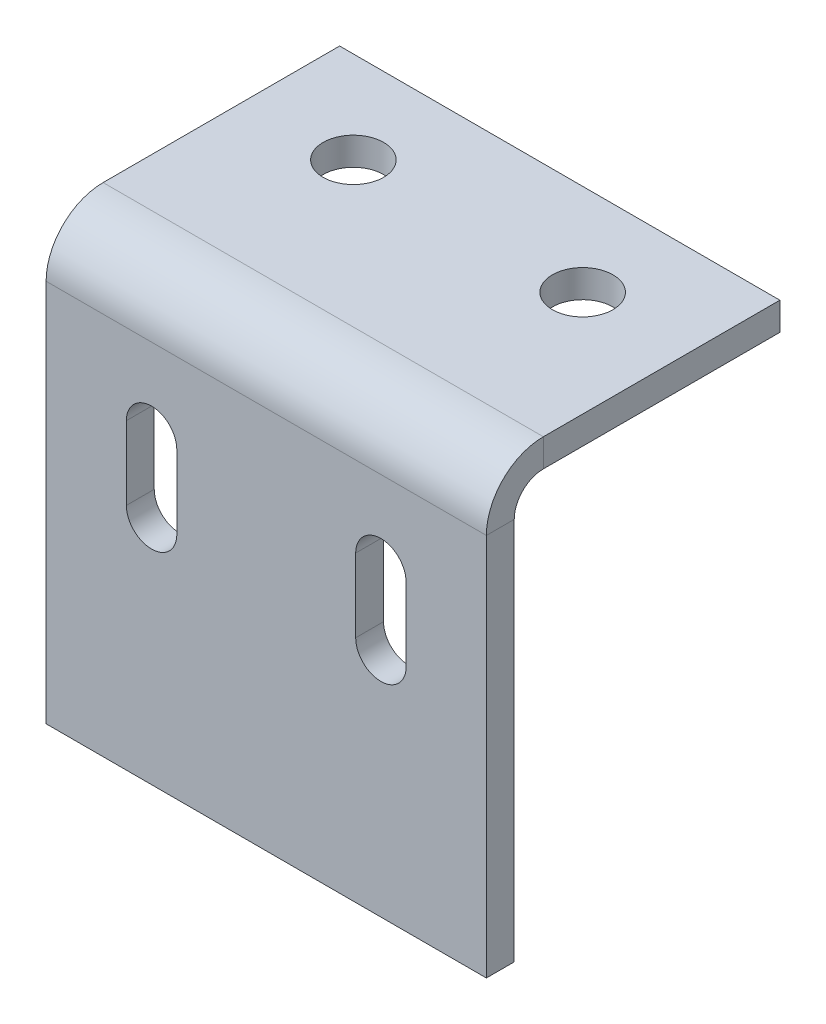
ISO-10303-21;
HEADER;
FILE_DESCRIPTION(('STEP AP214'),'2;1');
FILE_NAME('part.step','',(''),(''),'','','');
FILE_SCHEMA(('AUTOMOTIVE_DESIGN { 1 0 10303 214 1 1 1 1 }'));
ENDSEC;
DATA;
#1=APPLICATION_CONTEXT('core data for automotive mechanical design processes');
#2=APPLICATION_PROTOCOL_DEFINITION('international standard','automotive_design',2000,#1);
#3=PRODUCT_CONTEXT('',#1,'mechanical');
#4=PRODUCT('Part','Part','',(#3));
#5=PRODUCT_RELATED_PRODUCT_CATEGORY('part','',(#4));
#6=PRODUCT_DEFINITION_FORMATION('','',#4);
#7=PRODUCT_DEFINITION_CONTEXT('part definition',#1,'design');
#8=PRODUCT_DEFINITION('design','',#6,#7);
#9=PRODUCT_DEFINITION_SHAPE('','',#8);
#10=(LENGTH_UNIT() NAMED_UNIT(*) SI_UNIT(.MILLI.,.METRE.));
#11=(NAMED_UNIT(*) PLANE_ANGLE_UNIT() SI_UNIT($,.RADIAN.));
#12=(NAMED_UNIT(*) SI_UNIT($,.STERADIAN.) SOLID_ANGLE_UNIT());
#13=UNCERTAINTY_MEASURE_WITH_UNIT(LENGTH_MEASURE(1.E-05),#10,'distance_accuracy_value','');
#14=(GEOMETRIC_REPRESENTATION_CONTEXT(3) GLOBAL_UNCERTAINTY_ASSIGNED_CONTEXT((#13)) GLOBAL_UNIT_ASSIGNED_CONTEXT((#10,
#11,#12)) REPRESENTATION_CONTEXT('',''));
#15=CARTESIAN_POINT('',(0.,0.,0.));
#16=DIRECTION('',(0.,0.,1.));
#17=DIRECTION('',(1.,0.,0.));
#18=AXIS2_PLACEMENT_3D('',#15,#16,#17);
#19=CARTESIAN_POINT('',(-24.,-3.03784,-32.));
#20=DIRECTION('',(-1.,0.,0.));
#21=DIRECTION('',(0.,0.,1.));
#22=AXIS2_PLACEMENT_3D('',#19,#20,#21);
#23=PLANE('',#22);
#24=DIRECTION('',(0.,0.,1.));
#25=VECTOR('',#24,1.);
#26=CARTESIAN_POINT('',(-24.,-3.03784,-32.));
#27=LINE('',#26,#25);
#28=CARTESIAN_POINT('',(-24.,-3.03784,-32.));
#29=VERTEX_POINT('',#28);
#30=CARTESIAN_POINT('',(-24.,-3.03783999999999,-6.21283999999999));
#31=VERTEX_POINT('',#30);
#32=EDGE_CURVE('E286',#29,#31,#27,.T.);
#33=ORIENTED_EDGE('',*,*,#32,.T.);
#34=DIRECTION('',(0.,1.,0.));
#35=VECTOR('',#34,1.);
#36=CARTESIAN_POINT('',(-24.,-3.03783999999999,-6.21283999999999));
#37=LINE('',#36,#35);
#38=CARTESIAN_POINT('',(-24.,0.,-6.21283999999999));
#39=VERTEX_POINT('',#38);
#40=EDGE_CURVE('E270',#31,#39,#37,.T.);
#41=ORIENTED_EDGE('',*,*,#40,.T.);
#42=DIRECTION('',(0.,0.,1.));
#43=VECTOR('',#42,1.);
#44=CARTESIAN_POINT('',(-24.,0.,-32.));
#45=LINE('',#44,#43);
#46=CARTESIAN_POINT('',(-24.,0.,-32.));
#47=VERTEX_POINT('',#46);
#48=EDGE_CURVE('E283',#47,#39,#45,.T.);
#49=ORIENTED_EDGE('',*,*,#48,.F.);
#50=DIRECTION('',(0.,1.,0.));
#51=VECTOR('',#50,1.);
#52=CARTESIAN_POINT('',(-24.,-3.03784,-32.));
#53=LINE('',#52,#51);
#54=EDGE_CURVE('E302',#29,#47,#53,.T.);
#55=ORIENTED_EDGE('',*,*,#54,.F.);
#56=EDGE_LOOP('',(#33,#41,#49,#55));
#57=FACE_BOUND('',#56,.T.);
#58=ADVANCED_FACE('F58',(#57),#23,.T.);
#59=CARTESIAN_POINT('',(0.,-3.03784,0.));
#60=DIRECTION('',(0.,1.,0.));
#61=DIRECTION('',(0.,0.,1.));
#62=AXIS2_PLACEMENT_3D('',#59,#60,#61);
#63=PLANE('',#62);
#64=CARTESIAN_POINT('',(-12.5,-3.03784,-21.9999999999998));
#65=DIRECTION('',(0.,-1.,0.));
#66=DIRECTION('',(0.,0.,-1.));
#67=AXIS2_PLACEMENT_3D('',#64,#65,#66);
#68=CIRCLE('',#67,3.3);
#69=CARTESIAN_POINT('',(-12.5,-3.03784,-25.2999999999998));
#70=VERTEX_POINT('',#69);
#71=EDGE_CURVE('E212',#70,#70,#68,.T.);
#72=ORIENTED_EDGE('',*,*,#71,.F.);
#73=EDGE_LOOP('',(#72));
#74=FACE_BOUND('',#73,.T.);
#75=CARTESIAN_POINT('',(12.5,-3.03784,-21.9999999999998));
#76=DIRECTION('',(0.,-1.,0.));
#77=DIRECTION('',(0.,0.,-1.));
#78=AXIS2_PLACEMENT_3D('',#75,#76,#77);
#79=CIRCLE('',#78,3.3);
#80=CARTESIAN_POINT('',(12.5,-3.03784,-25.2999999999998));
#81=VERTEX_POINT('',#80);
#82=EDGE_CURVE('E224',#81,#81,#79,.T.);
#83=ORIENTED_EDGE('',*,*,#82,.F.);
#84=EDGE_LOOP('',(#83));
#85=FACE_BOUND('',#84,.T.);
#86=DIRECTION('',(-1.,0.,0.));
#87=VECTOR('',#86,1.);
#88=CARTESIAN_POINT('',(-24.,-3.03783999999999,-6.21283999999999));
#89=LINE('',#88,#87);
#90=CARTESIAN_POINT('',(24.,-3.03783999999999,-6.21283999999999));
#91=VERTEX_POINT('',#90);
#92=EDGE_CURVE('E276',#31,#91,#89,.F.);
#93=ORIENTED_EDGE('',*,*,#92,.F.);
#94=ORIENTED_EDGE('',*,*,#32,.F.);
#95=DIRECTION('',(-1.,0.,0.));
#96=VECTOR('',#95,1.);
#97=CARTESIAN_POINT('',(-24.,-3.03784,-32.));
#98=LINE('',#97,#96);
#99=CARTESIAN_POINT('',(24.,-3.03784,-32.));
#100=VERTEX_POINT('',#99);
#101=EDGE_CURVE('E292',#100,#29,#98,.T.);
#102=ORIENTED_EDGE('',*,*,#101,.F.);
#103=DIRECTION('',(0.,0.,-1.));
#104=VECTOR('',#103,1.);
#105=CARTESIAN_POINT('',(24.,-3.03784,-32.));
#106=LINE('',#105,#104);
#107=EDGE_CURVE('E289',#91,#100,#106,.T.);
#108=ORIENTED_EDGE('',*,*,#107,.F.);
#109=EDGE_LOOP('',(#93,#94,#102,#108));
#110=FACE_BOUND('',#109,.T.);
#111=ADVANCED_FACE('F342',(#74,#85,#110),#63,.F.);
#112=CARTESIAN_POINT('',(0.,0.,0.));
#113=DIRECTION('',(0.,1.,0.));
#114=DIRECTION('',(0.,0.,1.));
#115=AXIS2_PLACEMENT_3D('',#112,#113,#114);
#116=PLANE('',#115);
#117=CARTESIAN_POINT('',(-12.5,0.,-21.9999999999998));
#118=DIRECTION('',(0.,-1.,0.));
#119=DIRECTION('',(0.,0.,-1.));
#120=AXIS2_PLACEMENT_3D('',#117,#118,#119);
#121=CIRCLE('',#120,3.29999999999999);
#122=CARTESIAN_POINT('',(-12.5,0.,-25.2999999999998));
#123=VERTEX_POINT('',#122);
#124=EDGE_CURVE('E221',#123,#123,#121,.T.);
#125=ORIENTED_EDGE('',*,*,#124,.T.);
#126=EDGE_LOOP('',(#125));
#127=FACE_BOUND('',#126,.T.);
#128=CARTESIAN_POINT('',(12.5,0.,-21.9999999999998));
#129=DIRECTION('',(0.,-1.,0.));
#130=DIRECTION('',(0.,0.,-1.));
#131=AXIS2_PLACEMENT_3D('',#128,#129,#130);
#132=CIRCLE('',#131,3.29999999999999);
#133=CARTESIAN_POINT('',(12.5,0.,-25.2999999999998));
#134=VERTEX_POINT('',#133);
#135=EDGE_CURVE('E227',#134,#134,#132,.T.);
#136=ORIENTED_EDGE('',*,*,#135,.T.);
#137=EDGE_LOOP('',(#136));
#138=FACE_BOUND('',#137,.T.);
#139=ORIENTED_EDGE('',*,*,#48,.T.);
#140=DIRECTION('',(-1.,0.,0.));
#141=VECTOR('',#140,1.);
#142=CARTESIAN_POINT('',(-24.,0.,-6.21283999999999));
#143=LINE('',#142,#141);
#144=CARTESIAN_POINT('',(24.,0.,-6.21283999999999));
#145=VERTEX_POINT('',#144);
#146=EDGE_CURVE('E263',#39,#145,#143,.F.);
#147=ORIENTED_EDGE('',*,*,#146,.T.);
#148=DIRECTION('',(0.,0.,-1.));
#149=VECTOR('',#148,1.);
#150=CARTESIAN_POINT('',(24.,0.,-32.));
#151=LINE('',#150,#149);
#152=CARTESIAN_POINT('',(24.,0.,-32.));
#153=VERTEX_POINT('',#152);
#154=EDGE_CURVE('E298',#145,#153,#151,.T.);
#155=ORIENTED_EDGE('',*,*,#154,.T.);
#156=DIRECTION('',(-1.,0.,0.));
#157=VECTOR('',#156,1.);
#158=CARTESIAN_POINT('',(-24.,0.,-32.));
#159=LINE('',#158,#157);
#160=EDGE_CURVE('E290',#153,#47,#159,.T.);
#161=ORIENTED_EDGE('',*,*,#160,.T.);
#162=EDGE_LOOP('',(#139,#147,#155,#161));
#163=FACE_BOUND('',#162,.T.);
#164=ADVANCED_FACE('F347',(#127,#138,#163),#116,.T.);
#165=CARTESIAN_POINT('',(-24.,-3.03784,-32.));
#166=DIRECTION('',(0.,0.,-1.));
#167=DIRECTION('',(-1.,0.,0.));
#168=AXIS2_PLACEMENT_3D('',#165,#166,#167);
#169=PLANE('',#168);
#170=ORIENTED_EDGE('',*,*,#160,.F.);
#171=DIRECTION('',(0.,1.,0.));
#172=VECTOR('',#171,1.);
#173=CARTESIAN_POINT('',(24.,-3.03784,-32.));
#174=LINE('',#173,#172);
#175=EDGE_CURVE('E295',#100,#153,#174,.T.);
#176=ORIENTED_EDGE('',*,*,#175,.F.);
#177=ORIENTED_EDGE('',*,*,#101,.T.);
#178=ORIENTED_EDGE('',*,*,#54,.T.);
#179=EDGE_LOOP('',(#170,#176,#177,#178));
#180=FACE_BOUND('',#179,.T.);
#181=ADVANCED_FACE('F359',(#180),#169,.T.);
#182=CARTESIAN_POINT('',(24.,-3.03784,-32.));
#183=DIRECTION('',(1.,0.,0.));
#184=DIRECTION('',(0.,0.,-1.));
#185=AXIS2_PLACEMENT_3D('',#182,#183,#184);
#186=PLANE('',#185);
#187=DIRECTION('',(0.,1.,0.));
#188=VECTOR('',#187,1.);
#189=CARTESIAN_POINT('',(24.,-3.03783999999999,-6.21283999999999));
#190=LINE('',#189,#188);
#191=EDGE_CURVE('E280',#91,#145,#190,.T.);
#192=ORIENTED_EDGE('',*,*,#191,.F.);
#193=ORIENTED_EDGE('',*,*,#107,.T.);
#194=ORIENTED_EDGE('',*,*,#175,.T.);
#195=ORIENTED_EDGE('',*,*,#154,.F.);
#196=EDGE_LOOP('',(#192,#193,#194,#195));
#197=FACE_BOUND('',#196,.T.);
#198=ADVANCED_FACE('F363',(#197),#186,.T.);
#199=CARTESIAN_POINT('',(24.,-6.21283999999999,-6.21283999999999));
#200=DIRECTION('',(1.,0.,0.));
#201=DIRECTION('',(0.,0.,-1.));
#202=AXIS2_PLACEMENT_3D('',#199,#200,#201);
#203=PLANE('',#202);
#204=DIRECTION('',(0.,0.,1.));
#205=VECTOR('',#204,1.);
#206=CARTESIAN_POINT('',(24.,-6.21283999999999,1.56992474575901E-13));
#207=LINE('',#206,#205);
#208=CARTESIAN_POINT('',(24.,-6.21283999999998,-3.03783999999999));
#209=VERTEX_POINT('',#208);
#210=CARTESIAN_POINT('',(24.,-6.21283999999997,0.));
#211=VERTEX_POINT('',#210);
#212=EDGE_CURVE('E230',#209,#211,#207,.T.);
#213=ORIENTED_EDGE('',*,*,#212,.F.);
#214=CARTESIAN_POINT('',(24.,-6.21283999999999,-6.21283999999999));
#215=DIRECTION('',(-1.,0.,0.));
#216=DIRECTION('',(0.,0.,1.));
#217=AXIS2_PLACEMENT_3D('',#214,#215,#216);
#218=CIRCLE('',#217,3.175);
#219=EDGE_CURVE('E273',#91,#209,#218,.F.);
#220=ORIENTED_EDGE('',*,*,#219,.F.);
#221=ORIENTED_EDGE('',*,*,#191,.T.);
#222=CARTESIAN_POINT('',(24.,-6.21283999999999,-6.21283999999999));
#223=DIRECTION('',(-1.,0.,0.));
#224=DIRECTION('',(0.,0.,1.));
#225=AXIS2_PLACEMENT_3D('',#222,#223,#224);
#226=CIRCLE('',#225,6.21284);
#227=EDGE_CURVE('E266',#145,#211,#226,.F.);
#228=ORIENTED_EDGE('',*,*,#227,.T.);
#229=EDGE_LOOP('',(#213,#220,#221,#228));
#230=FACE_BOUND('',#229,.T.);
#231=ADVANCED_FACE('F366',(#230),#203,.T.);
#232=CARTESIAN_POINT('',(-24.,-6.21283999999999,-6.21283999999999));
#233=DIRECTION('',(1.,0.,0.));
#234=DIRECTION('',(0.,0.,-1.));
#235=AXIS2_PLACEMENT_3D('',#232,#233,#234);
#236=PLANE('',#235);
#237=CARTESIAN_POINT('',(-24.,-6.21283999999999,-6.21283999999999));
#238=DIRECTION('',(-1.,0.,0.));
#239=DIRECTION('',(0.,0.,1.));
#240=AXIS2_PLACEMENT_3D('',#237,#238,#239);
#241=CIRCLE('',#240,3.175);
#242=CARTESIAN_POINT('',(-24.,-6.21283999999998,-3.03783999999999));
#243=VERTEX_POINT('',#242);
#244=EDGE_CURVE('E233',#243,#31,#241,.T.);
#245=ORIENTED_EDGE('',*,*,#244,.F.);
#246=DIRECTION('',(0.,0.,1.));
#247=VECTOR('',#246,1.);
#248=CARTESIAN_POINT('',(-24.,-6.21283999999999,-3.03783999999999));
#249=LINE('',#248,#247);
#250=CARTESIAN_POINT('',(-24.,-6.21283999999999,0.));
#251=VERTEX_POINT('',#250);
#252=EDGE_CURVE('E256',#243,#251,#249,.T.);
#253=ORIENTED_EDGE('',*,*,#252,.T.);
#254=CARTESIAN_POINT('',(-24.,-6.21283999999999,-6.21283999999999));
#255=DIRECTION('',(-1.,0.,0.));
#256=DIRECTION('',(0.,0.,1.));
#257=AXIS2_PLACEMENT_3D('',#254,#255,#256);
#258=CIRCLE('',#257,6.21284);
#259=EDGE_CURVE('E267',#251,#39,#258,.T.);
#260=ORIENTED_EDGE('',*,*,#259,.T.);
#261=ORIENTED_EDGE('',*,*,#40,.F.);
#262=EDGE_LOOP('',(#245,#253,#260,#261));
#263=FACE_BOUND('',#262,.T.);
#264=ADVANCED_FACE('F372',(#263),#236,.F.);
#265=CARTESIAN_POINT('',(-24.,-6.21283999999999,-6.21283999999999));
#266=DIRECTION('',(-1.,0.,0.));
#267=DIRECTION('',(0.,0.,1.));
#268=AXIS2_PLACEMENT_3D('',#265,#266,#267);
#269=CYLINDRICAL_SURFACE('',#268,6.21284);
#270=ORIENTED_EDGE('',*,*,#146,.F.);
#271=ORIENTED_EDGE('',*,*,#259,.F.);
#272=DIRECTION('',(-1.,0.,0.));
#273=VECTOR('',#272,1.);
#274=CARTESIAN_POINT('',(0.,-6.21283999999999,0.));
#275=LINE('',#274,#273);
#276=EDGE_CURVE('E253',#211,#251,#275,.T.);
#277=ORIENTED_EDGE('',*,*,#276,.F.);
#278=ORIENTED_EDGE('',*,*,#227,.F.);
#279=EDGE_LOOP('',(#270,#271,#277,#278));
#280=FACE_BOUND('',#279,.T.);
#281=ADVANCED_FACE('F369',(#280),#269,.T.);
#282=CARTESIAN_POINT('',(-24.,-6.21283999999999,-6.21283999999999));
#283=DIRECTION('',(-1.,0.,0.));
#284=DIRECTION('',(0.,0.,1.));
#285=AXIS2_PLACEMENT_3D('',#282,#283,#284);
#286=CYLINDRICAL_SURFACE('',#285,3.175);
#287=ORIENTED_EDGE('',*,*,#92,.T.);
#288=ORIENTED_EDGE('',*,*,#219,.T.);
#289=DIRECTION('',(1.,0.,0.));
#290=VECTOR('',#289,1.);
#291=CARTESIAN_POINT('',(24.,-6.21283999999999,-3.03783999999999));
#292=LINE('',#291,#290);
#293=EDGE_CURVE('E259',#209,#243,#292,.F.);
#294=ORIENTED_EDGE('',*,*,#293,.T.);
#295=ORIENTED_EDGE('',*,*,#244,.T.);
#296=EDGE_LOOP('',(#287,#288,#294,#295));
#297=FACE_BOUND('',#296,.T.);
#298=ADVANCED_FACE('F390',(#297),#286,.F.);
#299=CARTESIAN_POINT('',(-24.,-3.03783999999999,0.));
#300=DIRECTION('',(-1.,0.,0.));
#301=DIRECTION('',(0.,0.,1.));
#302=AXIS2_PLACEMENT_3D('',#299,#300,#301);
#303=PLANE('',#302);
#304=DIRECTION('',(0.,1.,0.));
#305=VECTOR('',#304,1.);
#306=CARTESIAN_POINT('',(-24.,-3.03783999999999,0.));
#307=LINE('',#306,#305);
#308=CARTESIAN_POINT('',(-24.,-48.,1.5718276340861E-13));
#309=VERTEX_POINT('',#308);
#310=EDGE_CURVE('E237',#309,#251,#307,.T.);
#311=ORIENTED_EDGE('',*,*,#310,.T.);
#312=ORIENTED_EDGE('',*,*,#252,.F.);
#313=DIRECTION('',(0.,-1.,0.));
#314=VECTOR('',#313,1.);
#315=CARTESIAN_POINT('',(-24.,0.,-3.03784000000001));
#316=LINE('',#315,#314);
#317=CARTESIAN_POINT('',(-24.,-48.,-3.03783999999984));
#318=VERTEX_POINT('',#317);
#319=EDGE_CURVE('E245',#318,#243,#316,.F.);
#320=ORIENTED_EDGE('',*,*,#319,.F.);
#321=DIRECTION('',(0.,0.,-1.));
#322=VECTOR('',#321,1.);
#323=CARTESIAN_POINT('',(-24.,-48.,1.56992474575901E-13));
#324=LINE('',#323,#322);
#325=EDGE_CURVE('E231',#309,#318,#324,.T.);
#326=ORIENTED_EDGE('',*,*,#325,.F.);
#327=EDGE_LOOP('',(#311,#312,#320,#326));
#328=FACE_BOUND('',#327,.T.);
#329=ADVANCED_FACE('F380',(#328),#303,.T.);
#330=CARTESIAN_POINT('',(24.,-48.,1.56992474575901E-13));
#331=DIRECTION('',(1.,0.,0.));
#332=DIRECTION('',(0.,1.,0.));
#333=AXIS2_PLACEMENT_3D('',#330,#331,#332);
#334=PLANE('',#333);
#335=DIRECTION('',(0.,1.,0.));
#336=VECTOR('',#335,1.);
#337=CARTESIAN_POINT('',(24.,0.,-3.03784000000001));
#338=LINE('',#337,#336);
#339=CARTESIAN_POINT('',(24.,-48.,-3.03783999999984));
#340=VERTEX_POINT('',#339);
#341=EDGE_CURVE('E251',#209,#340,#338,.F.);
#342=ORIENTED_EDGE('',*,*,#341,.F.);
#343=ORIENTED_EDGE('',*,*,#212,.T.);
#344=DIRECTION('',(0.,-1.,0.));
#345=VECTOR('',#344,1.);
#346=CARTESIAN_POINT('',(24.,-48.,1.5718276340861E-13));
#347=LINE('',#346,#345);
#348=CARTESIAN_POINT('',(24.,-48.,1.5718276340861E-13));
#349=VERTEX_POINT('',#348);
#350=EDGE_CURVE('E243',#211,#349,#347,.T.);
#351=ORIENTED_EDGE('',*,*,#350,.T.);
#352=DIRECTION('',(0.,0.,-1.));
#353=VECTOR('',#352,1.);
#354=CARTESIAN_POINT('',(24.,-48.,1.56992474575901E-13));
#355=LINE('',#354,#353);
#356=EDGE_CURVE('E234',#349,#340,#355,.T.);
#357=ORIENTED_EDGE('',*,*,#356,.T.);
#358=EDGE_LOOP('',(#342,#343,#351,#357));
#359=FACE_BOUND('',#358,.T.);
#360=ADVANCED_FACE('F387',(#359),#334,.T.);
#361=CARTESIAN_POINT('',(0.,0.,0.));
#362=DIRECTION('',(0.,0.,1.));
#363=DIRECTION('',(0.,-1.,0.));
#364=AXIS2_PLACEMENT_3D('',#361,#362,#363);
#365=PLANE('',#364);
#366=CARTESIAN_POINT('',(12.5,-15.,0.));
#367=DIRECTION('',(0.,0.,1.));
#368=DIRECTION('',(1.,0.,0.));
#369=AXIS2_PLACEMENT_3D('',#366,#367,#368);
#370=CIRCLE('',#369,2.75);
#371=CARTESIAN_POINT('',(15.25,-15.,0.));
#372=VERTEX_POINT('',#371);
#373=CARTESIAN_POINT('',(9.75,-15.,0.));
#374=VERTEX_POINT('',#373);
#375=EDGE_CURVE('E72',#372,#374,#370,.T.);
#376=ORIENTED_EDGE('',*,*,#375,.F.);
#377=DIRECTION('',(0.,1.,0.));
#378=VECTOR('',#377,1.);
#379=CARTESIAN_POINT('',(15.25,-15.,0.));
#380=LINE('',#379,#378);
#381=CARTESIAN_POINT('',(15.25,-23.,0.));
#382=VERTEX_POINT('',#381);
#383=EDGE_CURVE('E189',#382,#372,#380,.T.);
#384=ORIENTED_EDGE('',*,*,#383,.F.);
#385=CARTESIAN_POINT('',(12.5,-23.,0.));
#386=DIRECTION('',(0.,0.,1.));
#387=DIRECTION('',(1.,0.,0.));
#388=AXIS2_PLACEMENT_3D('',#385,#386,#387);
#389=CIRCLE('',#388,2.75);
#390=CARTESIAN_POINT('',(9.75,-23.,0.));
#391=VERTEX_POINT('',#390);
#392=EDGE_CURVE('E173',#391,#382,#389,.T.);
#393=ORIENTED_EDGE('',*,*,#392,.F.);
#394=DIRECTION('',(0.,-1.,0.));
#395=VECTOR('',#394,1.);
#396=CARTESIAN_POINT('',(9.75,-15.,0.));
#397=LINE('',#396,#395);
#398=EDGE_CURVE('E182',#374,#391,#397,.T.);
#399=ORIENTED_EDGE('',*,*,#398,.F.);
#400=EDGE_LOOP('',(#376,#384,#393,#399));
#401=FACE_BOUND('',#400,.T.);
#402=CARTESIAN_POINT('',(-12.5,-15.,0.));
#403=DIRECTION('',(0.,0.,1.));
#404=DIRECTION('',(1.,0.,0.));
#405=AXIS2_PLACEMENT_3D('',#402,#403,#404);
#406=CIRCLE('',#405,2.75);
#407=CARTESIAN_POINT('',(-9.75,-15.,0.));
#408=VERTEX_POINT('',#407);
#409=CARTESIAN_POINT('',(-15.25,-15.,0.));
#410=VERTEX_POINT('',#409);
#411=EDGE_CURVE('E196',#408,#410,#406,.T.);
#412=ORIENTED_EDGE('',*,*,#411,.F.);
#413=DIRECTION('',(0.,1.,0.));
#414=VECTOR('',#413,1.);
#415=CARTESIAN_POINT('',(-9.75,-15.,0.));
#416=LINE('',#415,#414);
#417=CARTESIAN_POINT('',(-9.75,-23.,0.));
#418=VERTEX_POINT('',#417);
#419=EDGE_CURVE('E206',#418,#408,#416,.T.);
#420=ORIENTED_EDGE('',*,*,#419,.F.);
#421=CARTESIAN_POINT('',(-12.5,-23.,0.));
#422=DIRECTION('',(0.,0.,1.));
#423=DIRECTION('',(1.,0.,0.));
#424=AXIS2_PLACEMENT_3D('',#421,#422,#423);
#425=CIRCLE('',#424,2.75);
#426=CARTESIAN_POINT('',(-15.25,-23.,0.));
#427=VERTEX_POINT('',#426);
#428=EDGE_CURVE('E203',#427,#418,#425,.T.);
#429=ORIENTED_EDGE('',*,*,#428,.F.);
#430=DIRECTION('',(0.,-1.,0.));
#431=VECTOR('',#430,1.);
#432=CARTESIAN_POINT('',(-15.25,-15.,0.));
#433=LINE('',#432,#431);
#434=EDGE_CURVE('E200',#410,#427,#433,.T.);
#435=ORIENTED_EDGE('',*,*,#434,.F.);
#436=EDGE_LOOP('',(#412,#420,#429,#435));
#437=FACE_BOUND('',#436,.T.);
#438=ORIENTED_EDGE('',*,*,#350,.F.);
#439=ORIENTED_EDGE('',*,*,#276,.T.);
#440=ORIENTED_EDGE('',*,*,#310,.F.);
#441=DIRECTION('',(-1.,0.,0.));
#442=VECTOR('',#441,1.);
#443=CARTESIAN_POINT('',(-24.,-48.,1.5718276340861E-13));
#444=LINE('',#443,#442);
#445=EDGE_CURVE('E240',#349,#309,#444,.T.);
#446=ORIENTED_EDGE('',*,*,#445,.F.);
#447=EDGE_LOOP('',(#438,#439,#440,#446));
#448=FACE_BOUND('',#447,.T.);
#449=ADVANCED_FACE('F186',(#401,#437,#448),#365,.T.);
#450=CARTESIAN_POINT('',(0.,0.,-3.03784000000001));
#451=DIRECTION('',(0.,0.,1.));
#452=DIRECTION('',(0.,-1.,0.));
#453=AXIS2_PLACEMENT_3D('',#450,#451,#452);
#454=PLANE('',#453);
#455=DIRECTION('',(0.,1.,0.));
#456=VECTOR('',#455,1.);
#457=CARTESIAN_POINT('',(15.25,0.,-3.03784000000001));
#458=LINE('',#457,#456);
#459=CARTESIAN_POINT('',(15.25,-23.,-3.03783999999992));
#460=VERTEX_POINT('',#459);
#461=CARTESIAN_POINT('',(15.25,-15.,-3.03783999999994));
#462=VERTEX_POINT('',#461);
#463=EDGE_CURVE('E65',#460,#462,#458,.T.);
#464=ORIENTED_EDGE('',*,*,#463,.T.);
#465=CARTESIAN_POINT('',(12.5,-15.,-3.03783999999996));
#466=DIRECTION('',(0.,0.,1.));
#467=DIRECTION('',(0.,-1.,0.));
#468=AXIS2_PLACEMENT_3D('',#465,#466,#467);
#469=CIRCLE('',#468,2.75);
#470=CARTESIAN_POINT('',(9.75,-15.,-3.03783999999994));
#471=VERTEX_POINT('',#470);
#472=EDGE_CURVE('E13',#462,#471,#469,.T.);
#473=ORIENTED_EDGE('',*,*,#472,.T.);
#474=DIRECTION('',(0.,-1.,0.));
#475=VECTOR('',#474,1.);
#476=CARTESIAN_POINT('',(9.75,0.,-3.03784000000001));
#477=LINE('',#476,#475);
#478=CARTESIAN_POINT('',(9.75,-23.,-3.03783999999993));
#479=VERTEX_POINT('',#478);
#480=EDGE_CURVE('E318',#471,#479,#477,.T.);
#481=ORIENTED_EDGE('',*,*,#480,.T.);
#482=CARTESIAN_POINT('',(12.5,-23.,-3.03783999999993));
#483=DIRECTION('',(0.,0.,1.));
#484=DIRECTION('',(0.,-1.,0.));
#485=AXIS2_PLACEMENT_3D('',#482,#483,#484);
#486=CIRCLE('',#485,2.75);
#487=EDGE_CURVE('E176',#479,#460,#486,.T.);
#488=ORIENTED_EDGE('',*,*,#487,.T.);
#489=EDGE_LOOP('',(#464,#473,#481,#488));
#490=FACE_BOUND('',#489,.T.);
#491=DIRECTION('',(0.,1.,0.));
#492=VECTOR('',#491,1.);
#493=CARTESIAN_POINT('',(-9.75,0.,-3.03784000000001));
#494=LINE('',#493,#492);
#495=CARTESIAN_POINT('',(-9.75,-23.,-3.03783999999992));
#496=VERTEX_POINT('',#495);
#497=CARTESIAN_POINT('',(-9.75,-15.,-3.03783999999994));
#498=VERTEX_POINT('',#497);
#499=EDGE_CURVE('E312',#496,#498,#494,.T.);
#500=ORIENTED_EDGE('',*,*,#499,.T.);
#501=CARTESIAN_POINT('',(-12.5,-15.,-3.03783999999996));
#502=DIRECTION('',(0.,0.,1.));
#503=DIRECTION('',(0.,-1.,0.));
#504=AXIS2_PLACEMENT_3D('',#501,#502,#503);
#505=CIRCLE('',#504,2.75);
#506=CARTESIAN_POINT('',(-15.25,-15.,-3.03783999999994));
#507=VERTEX_POINT('',#506);
#508=EDGE_CURVE('E315',#498,#507,#505,.T.);
#509=ORIENTED_EDGE('',*,*,#508,.T.);
#510=DIRECTION('',(0.,-1.,0.));
#511=VECTOR('',#510,1.);
#512=CARTESIAN_POINT('',(-15.25,0.,-3.03784000000001));
#513=LINE('',#512,#511);
#514=CARTESIAN_POINT('',(-15.25,-23.,-3.03783999999993));
#515=VERTEX_POINT('',#514);
#516=EDGE_CURVE('E304',#507,#515,#513,.T.);
#517=ORIENTED_EDGE('',*,*,#516,.T.);
#518=CARTESIAN_POINT('',(-12.5,-23.,-3.03783999999993));
#519=DIRECTION('',(0.,0.,1.));
#520=DIRECTION('',(0.,-1.,0.));
#521=AXIS2_PLACEMENT_3D('',#518,#519,#520);
#522=CIRCLE('',#521,2.75);
#523=EDGE_CURVE('E309',#515,#496,#522,.T.);
#524=ORIENTED_EDGE('',*,*,#523,.T.);
#525=EDGE_LOOP('',(#500,#509,#517,#524));
#526=FACE_BOUND('',#525,.T.);
#527=ORIENTED_EDGE('',*,*,#293,.F.);
#528=ORIENTED_EDGE('',*,*,#341,.T.);
#529=DIRECTION('',(1.,0.,0.));
#530=VECTOR('',#529,1.);
#531=CARTESIAN_POINT('',(0.,-48.,-3.03783999999984));
#532=LINE('',#531,#530);
#533=EDGE_CURVE('E248',#340,#318,#532,.F.);
#534=ORIENTED_EDGE('',*,*,#533,.T.);
#535=ORIENTED_EDGE('',*,*,#319,.T.);
#536=EDGE_LOOP('',(#527,#528,#534,#535));
#537=FACE_BOUND('',#536,.T.);
#538=ADVANCED_FACE('F322',(#490,#526,#537),#454,.F.);
#539=CARTESIAN_POINT('',(-24.,-48.,1.56992474575901E-13));
#540=DIRECTION('',(0.,-1.,0.));
#541=DIRECTION('',(0.,0.,-1.));
#542=AXIS2_PLACEMENT_3D('',#539,#540,#541);
#543=PLANE('',#542);
#544=ORIENTED_EDGE('',*,*,#533,.F.);
#545=ORIENTED_EDGE('',*,*,#356,.F.);
#546=ORIENTED_EDGE('',*,*,#445,.T.);
#547=ORIENTED_EDGE('',*,*,#325,.T.);
#548=EDGE_LOOP('',(#544,#545,#546,#547));
#549=FACE_BOUND('',#548,.T.);
#550=ADVANCED_FACE('F384',(#549),#543,.T.);
#551=CARTESIAN_POINT('',(12.5,-3.03784,-21.9999999999998));
#552=DIRECTION('',(0.,-1.,0.));
#553=DIRECTION('',(0.,0.,-1.));
#554=AXIS2_PLACEMENT_3D('',#551,#552,#553);
#555=CYLINDRICAL_SURFACE('',#554,3.3);
#556=ORIENTED_EDGE('',*,*,#135,.F.);
#557=EDGE_LOOP('',(#556));
#558=FACE_BOUND('',#557,.T.);
#559=ORIENTED_EDGE('',*,*,#82,.T.);
#560=EDGE_LOOP('',(#559));
#561=FACE_BOUND('',#560,.T.);
#562=ADVANCED_FACE('F398',(#558,#561),#555,.F.);
#563=CARTESIAN_POINT('',(-12.5,-3.03784,-21.9999999999998));
#564=DIRECTION('',(0.,-1.,0.));
#565=DIRECTION('',(0.,0.,-1.));
#566=AXIS2_PLACEMENT_3D('',#563,#564,#565);
#567=CYLINDRICAL_SURFACE('',#566,3.3);
#568=ORIENTED_EDGE('',*,*,#124,.F.);
#569=EDGE_LOOP('',(#568));
#570=FACE_BOUND('',#569,.T.);
#571=ORIENTED_EDGE('',*,*,#71,.T.);
#572=EDGE_LOOP('',(#571));
#573=FACE_BOUND('',#572,.T.);
#574=ADVANCED_FACE('F460',(#570,#573),#567,.F.);
#575=CARTESIAN_POINT('',(-12.5,-15.,-32.));
#576=DIRECTION('',(0.,0.,1.));
#577=DIRECTION('',(1.,0.,0.));
#578=AXIS2_PLACEMENT_3D('',#575,#576,#577);
#579=CYLINDRICAL_SURFACE('',#578,2.75);
#580=DIRECTION('',(0.,0.,1.));
#581=VECTOR('',#580,1.);
#582=CARTESIAN_POINT('',(-9.75,-15.,-32.));
#583=LINE('',#582,#581);
#584=EDGE_CURVE('E210',#498,#408,#583,.T.);
#585=ORIENTED_EDGE('',*,*,#584,.T.);
#586=ORIENTED_EDGE('',*,*,#411,.T.);
#587=DIRECTION('',(0.,0.,1.));
#588=VECTOR('',#587,1.);
#589=CARTESIAN_POINT('',(-15.25,-15.,-32.));
#590=LINE('',#589,#588);
#591=EDGE_CURVE('E209',#507,#410,#590,.T.);
#592=ORIENTED_EDGE('',*,*,#591,.F.);
#593=ORIENTED_EDGE('',*,*,#508,.F.);
#594=EDGE_LOOP('',(#585,#586,#592,#593));
#595=FACE_BOUND('',#594,.T.);
#596=ADVANCED_FACE('F471',(#595),#579,.F.);
#597=CARTESIAN_POINT('',(-9.75,-15.,-32.));
#598=DIRECTION('',(1.,0.,0.));
#599=DIRECTION('',(0.,1.,0.));
#600=AXIS2_PLACEMENT_3D('',#597,#598,#599);
#601=PLANE('',#600);
#602=DIRECTION('',(0.,0.,1.));
#603=VECTOR('',#602,1.);
#604=CARTESIAN_POINT('',(-9.75,-23.,-32.));
#605=LINE('',#604,#603);
#606=EDGE_CURVE('E213',#496,#418,#605,.T.);
#607=ORIENTED_EDGE('',*,*,#606,.T.);
#608=ORIENTED_EDGE('',*,*,#419,.T.);
#609=ORIENTED_EDGE('',*,*,#584,.F.);
#610=ORIENTED_EDGE('',*,*,#499,.F.);
#611=EDGE_LOOP('',(#607,#608,#609,#610));
#612=FACE_BOUND('',#611,.T.);
#613=ADVANCED_FACE('F476',(#612),#601,.F.);
#614=CARTESIAN_POINT('',(-12.5,-23.,-32.));
#615=DIRECTION('',(0.,0.,1.));
#616=DIRECTION('',(1.,0.,0.));
#617=AXIS2_PLACEMENT_3D('',#614,#615,#616);
#618=CYLINDRICAL_SURFACE('',#617,2.75);
#619=DIRECTION('',(0.,0.,1.));
#620=VECTOR('',#619,1.);
#621=CARTESIAN_POINT('',(-15.25,-23.,-32.));
#622=LINE('',#621,#620);
#623=EDGE_CURVE('E215',#515,#427,#622,.T.);
#624=ORIENTED_EDGE('',*,*,#623,.T.);
#625=ORIENTED_EDGE('',*,*,#428,.T.);
#626=ORIENTED_EDGE('',*,*,#606,.F.);
#627=ORIENTED_EDGE('',*,*,#523,.F.);
#628=EDGE_LOOP('',(#624,#625,#626,#627));
#629=FACE_BOUND('',#628,.T.);
#630=ADVANCED_FACE('F336',(#629),#618,.F.);
#631=CARTESIAN_POINT('',(-15.25,-15.,-32.));
#632=DIRECTION('',(-1.,0.,0.));
#633=DIRECTION('',(0.,-1.,0.));
#634=AXIS2_PLACEMENT_3D('',#631,#632,#633);
#635=PLANE('',#634);
#636=ORIENTED_EDGE('',*,*,#591,.T.);
#637=ORIENTED_EDGE('',*,*,#434,.T.);
#638=ORIENTED_EDGE('',*,*,#623,.F.);
#639=ORIENTED_EDGE('',*,*,#516,.F.);
#640=EDGE_LOOP('',(#636,#637,#638,#639));
#641=FACE_BOUND('',#640,.T.);
#642=ADVANCED_FACE('F329',(#641),#635,.F.);
#643=CARTESIAN_POINT('',(12.5,-15.,-32.));
#644=DIRECTION('',(0.,0.,1.));
#645=DIRECTION('',(1.,0.,0.));
#646=AXIS2_PLACEMENT_3D('',#643,#644,#645);
#647=CYLINDRICAL_SURFACE('',#646,2.75);
#648=DIRECTION('',(0.,0.,1.));
#649=VECTOR('',#648,1.);
#650=CARTESIAN_POINT('',(15.25,-15.,-32.));
#651=LINE('',#650,#649);
#652=EDGE_CURVE('E194',#462,#372,#651,.T.);
#653=ORIENTED_EDGE('',*,*,#652,.T.);
#654=ORIENTED_EDGE('',*,*,#375,.T.);
#655=DIRECTION('',(0.,0.,1.));
#656=VECTOR('',#655,1.);
#657=CARTESIAN_POINT('',(9.75,-15.,-32.));
#658=LINE('',#657,#656);
#659=EDGE_CURVE('E179',#471,#374,#658,.T.);
#660=ORIENTED_EDGE('',*,*,#659,.F.);
#661=ORIENTED_EDGE('',*,*,#472,.F.);
#662=EDGE_LOOP('',(#653,#654,#660,#661));
#663=FACE_BOUND('',#662,.T.);
#664=ADVANCED_FACE('F327',(#663),#647,.F.);
#665=CARTESIAN_POINT('',(15.25,-15.,-32.));
#666=DIRECTION('',(1.,0.,0.));
#667=DIRECTION('',(0.,0.,-1.));
#668=AXIS2_PLACEMENT_3D('',#665,#666,#667);
#669=PLANE('',#668);
#670=DIRECTION('',(0.,0.,1.));
#671=VECTOR('',#670,1.);
#672=CARTESIAN_POINT('',(15.25,-23.,-32.));
#673=LINE('',#672,#671);
#674=EDGE_CURVE('E178',#460,#382,#673,.T.);
#675=ORIENTED_EDGE('',*,*,#674,.T.);
#676=ORIENTED_EDGE('',*,*,#383,.T.);
#677=ORIENTED_EDGE('',*,*,#652,.F.);
#678=ORIENTED_EDGE('',*,*,#463,.F.);
#679=EDGE_LOOP('',(#675,#676,#677,#678));
#680=FACE_BOUND('',#679,.T.);
#681=ADVANCED_FACE('F326',(#680),#669,.F.);
#682=CARTESIAN_POINT('',(12.5,-23.,-32.));
#683=DIRECTION('',(0.,0.,1.));
#684=DIRECTION('',(1.,0.,0.));
#685=AXIS2_PLACEMENT_3D('',#682,#683,#684);
#686=CYLINDRICAL_SURFACE('',#685,2.75);
#687=DIRECTION('',(0.,0.,1.));
#688=VECTOR('',#687,1.);
#689=CARTESIAN_POINT('',(9.75,-23.,-32.));
#690=LINE('',#689,#688);
#691=EDGE_CURVE('E80',#479,#391,#690,.T.);
#692=ORIENTED_EDGE('',*,*,#691,.T.);
#693=ORIENTED_EDGE('',*,*,#392,.T.);
#694=ORIENTED_EDGE('',*,*,#674,.F.);
#695=ORIENTED_EDGE('',*,*,#487,.F.);
#696=EDGE_LOOP('',(#692,#693,#694,#695));
#697=FACE_BOUND('',#696,.T.);
#698=ADVANCED_FACE('F170',(#697),#686,.F.);
#699=CARTESIAN_POINT('',(9.75,-15.,-32.));
#700=DIRECTION('',(-1.,0.,0.));
#701=DIRECTION('',(0.,0.,1.));
#702=AXIS2_PLACEMENT_3D('',#699,#700,#701);
#703=PLANE('',#702);
#704=ORIENTED_EDGE('',*,*,#659,.T.);
#705=ORIENTED_EDGE('',*,*,#398,.T.);
#706=ORIENTED_EDGE('',*,*,#691,.F.);
#707=ORIENTED_EDGE('',*,*,#480,.F.);
#708=EDGE_LOOP('',(#704,#705,#706,#707));
#709=FACE_BOUND('',#708,.T.);
#710=ADVANCED_FACE('F183',(#709),#703,.F.);
#711=CLOSED_SHELL('',(#58,#111,#164,#181,#198,#231,#264,#281,#298,#329,#360,#449,#538,#550,#562,
#574,#596,#613,#630,#642,#664,#681,#698,#710));
#712=MANIFOLD_SOLID_BREP('B2',#711);
#713=ADVANCED_BREP_SHAPE_REPRESENTATION('',(#18,#712),#14);
#714=SHAPE_DEFINITION_REPRESENTATION(#9,#713);
ENDSEC;
END-ISO-10303-21;
